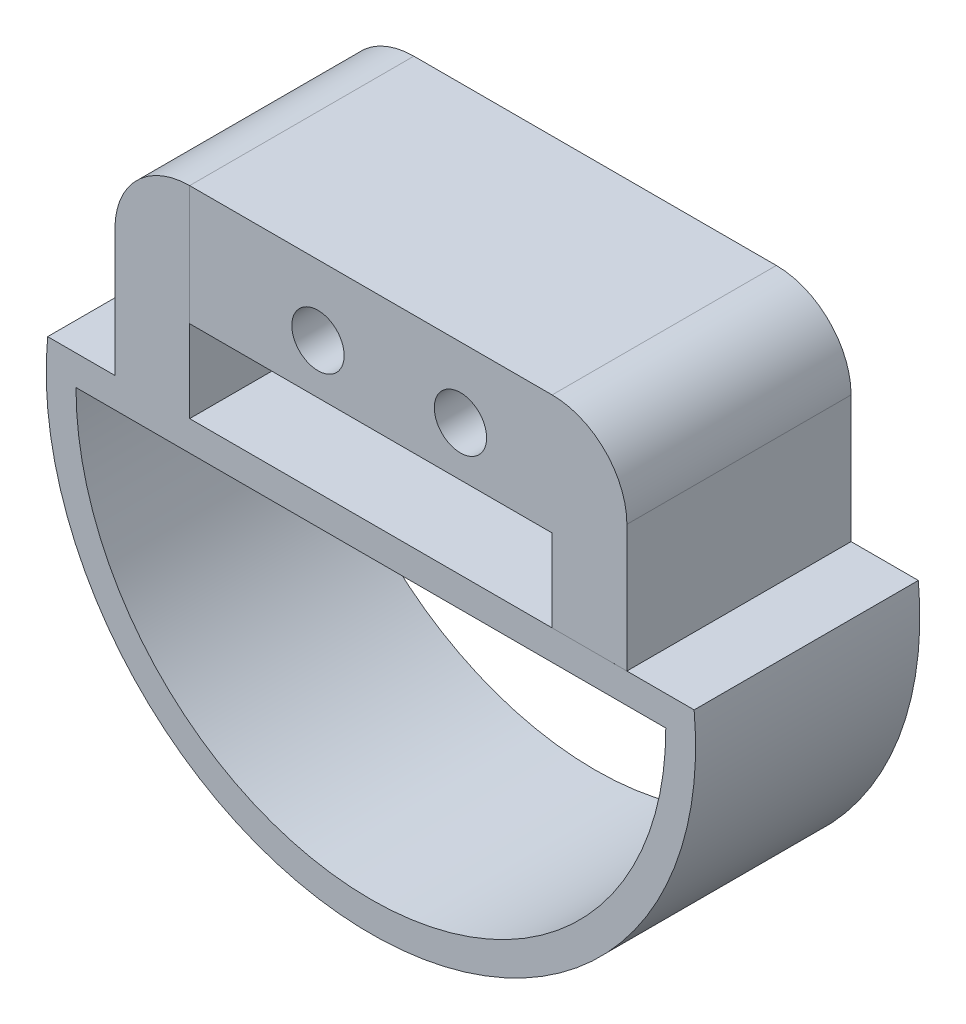
ISO-10303-21;
HEADER;
FILE_DESCRIPTION(('STEP AP214'),'2;1');
FILE_NAME('part.step','',(''),(''),'','','');
FILE_SCHEMA(('AUTOMOTIVE_DESIGN { 1 0 10303 214 1 1 1 1 }'));
ENDSEC;
DATA;
#1=APPLICATION_CONTEXT('core data for automotive mechanical design processes');
#2=APPLICATION_PROTOCOL_DEFINITION('international standard','automotive_design',2000,#1);
#3=PRODUCT_CONTEXT('',#1,'mechanical');
#4=PRODUCT('Part','Part','',(#3));
#5=PRODUCT_RELATED_PRODUCT_CATEGORY('part','',(#4));
#6=PRODUCT_DEFINITION_FORMATION('','',#4);
#7=PRODUCT_DEFINITION_CONTEXT('part definition',#1,'design');
#8=PRODUCT_DEFINITION('design','',#6,#7);
#9=PRODUCT_DEFINITION_SHAPE('','',#8);
#10=(LENGTH_UNIT() NAMED_UNIT(*) SI_UNIT(.MILLI.,.METRE.));
#11=(NAMED_UNIT(*) PLANE_ANGLE_UNIT() SI_UNIT($,.RADIAN.));
#12=(NAMED_UNIT(*) SI_UNIT($,.STERADIAN.) SOLID_ANGLE_UNIT());
#13=UNCERTAINTY_MEASURE_WITH_UNIT(LENGTH_MEASURE(1.E-05),#10,'distance_accuracy_value','');
#14=(GEOMETRIC_REPRESENTATION_CONTEXT(3) GLOBAL_UNCERTAINTY_ASSIGNED_CONTEXT((#13)) GLOBAL_UNIT_ASSIGNED_CONTEXT((#10,
#11,#12)) REPRESENTATION_CONTEXT('',''));
#15=CARTESIAN_POINT('',(0.,0.,0.));
#16=DIRECTION('',(0.,0.,1.));
#17=DIRECTION('',(1.,0.,0.));
#18=AXIS2_PLACEMENT_3D('',#15,#16,#17);
#19=CARTESIAN_POINT('',(12.1263897601692,15.5675809394675,14.9999));
#20=DIRECTION('',(1.,0.,0.));
#21=DIRECTION('',(0.,0.,-1.));
#22=AXIS2_PLACEMENT_3D('',#19,#20,#21);
#23=PLANE('',#22);
#24=DIRECTION('',(0.,0.,1.));
#25=VECTOR('',#24,1.);
#26=CARTESIAN_POINT('',(12.1263897601692,7.56758093946746,-9.9999999998408E-05));
#27=LINE('',#26,#25);
#28=CARTESIAN_POINT('',(12.1263897601692,7.56758093946746,-9.9999999998408E-05));
#29=VERTEX_POINT('',#28);
#30=CARTESIAN_POINT('',(12.1263897601692,7.56758093946746,14.9999));
#31=VERTEX_POINT('',#30);
#32=EDGE_CURVE('E161',#29,#31,#27,.T.);
#33=ORIENTED_EDGE('',*,*,#32,.F.);
#34=DIRECTION('',(0.,-1.,0.));
#35=VECTOR('',#34,1.);
#36=CARTESIAN_POINT('',(12.1263897601692,15.5675809394675,-9.99999999993877E-05));
#37=LINE('',#36,#35);
#38=CARTESIAN_POINT('',(12.1263897601692,2.06758093946746,-9.99999999993877E-05));
#39=VERTEX_POINT('',#38);
#40=EDGE_CURVE('E194',#29,#39,#37,.T.);
#41=ORIENTED_EDGE('',*,*,#40,.T.);
#42=DIRECTION('',(0.,0.,1.));
#43=VECTOR('',#42,1.);
#44=CARTESIAN_POINT('',(12.1263897601692,2.06758093946746,14.9999));
#45=LINE('',#44,#43);
#46=CARTESIAN_POINT('',(12.1263897601692,2.06758093946746,14.9999));
#47=VERTEX_POINT('',#46);
#48=EDGE_CURVE('E188',#39,#47,#45,.T.);
#49=ORIENTED_EDGE('',*,*,#48,.T.);
#50=DIRECTION('',(0.,-1.,0.));
#51=VECTOR('',#50,1.);
#52=CARTESIAN_POINT('',(12.1263897601692,15.5675809394675,14.9999));
#53=LINE('',#52,#51);
#54=EDGE_CURVE('E207',#31,#47,#53,.T.);
#55=ORIENTED_EDGE('',*,*,#54,.F.);
#56=EDGE_LOOP('',(#33,#41,#49,#55));
#57=FACE_BOUND('',#56,.T.);
#58=ADVANCED_FACE('F41',(#57),#23,.F.);
#59=CARTESIAN_POINT('',(-12.1263897601692,15.5675809394675,15.));
#60=DIRECTION('',(-1.,0.,0.));
#61=DIRECTION('',(0.,0.,1.));
#62=AXIS2_PLACEMENT_3D('',#59,#60,#61);
#63=PLANE('',#62);
#64=DIRECTION('',(0.,0.,1.));
#65=VECTOR('',#64,1.);
#66=CARTESIAN_POINT('',(-12.1263897601692,7.56758093946746,-9.99999999944929E-05));
#67=LINE('',#66,#65);
#68=CARTESIAN_POINT('',(-12.1263897601692,7.56758093946746,-9.99999999956032E-05));
#69=VERTEX_POINT('',#68);
#70=CARTESIAN_POINT('',(-12.1263897601692,7.56758093946746,14.9999));
#71=VERTEX_POINT('',#70);
#72=EDGE_CURVE('E155',#69,#71,#67,.T.);
#73=ORIENTED_EDGE('',*,*,#72,.T.);
#74=DIRECTION('',(0.,1.,0.));
#75=VECTOR('',#74,1.);
#76=CARTESIAN_POINT('',(-12.1263897601692,15.5675809394675,14.9999));
#77=LINE('',#76,#75);
#78=CARTESIAN_POINT('',(-12.1263897601692,15.5675809394675,14.9999));
#79=VERTEX_POINT('',#78);
#80=EDGE_CURVE('E143',#71,#79,#77,.T.);
#81=ORIENTED_EDGE('',*,*,#80,.T.);
#82=DIRECTION('',(0.,0.,-1.));
#83=VECTOR('',#82,1.);
#84=CARTESIAN_POINT('',(-12.1263897601692,15.5675809394675,15.));
#85=LINE('',#84,#83);
#86=CARTESIAN_POINT('',(-12.1263897601692,15.5675809394675,15.));
#87=VERTEX_POINT('',#86);
#88=EDGE_CURVE('E174',#87,#79,#85,.T.);
#89=ORIENTED_EDGE('',*,*,#88,.F.);
#90=DIRECTION('',(0.,-1.,0.));
#91=VECTOR('',#90,1.);
#92=CARTESIAN_POINT('',(-12.1263897601692,15.5675809394675,15.));
#93=LINE('',#92,#91);
#94=CARTESIAN_POINT('',(-12.1263897601692,2.06758093946746,15.));
#95=VERTEX_POINT('',#94);
#96=EDGE_CURVE('E184',#87,#95,#93,.T.);
#97=ORIENTED_EDGE('',*,*,#96,.T.);
#98=DIRECTION('',(0.,0.,-1.));
#99=VECTOR('',#98,1.);
#100=CARTESIAN_POINT('',(-12.1263897601692,2.06758093946746,15.));
#101=LINE('',#100,#99);
#102=CARTESIAN_POINT('',(-12.1263897601692,2.06758093946746,-0.0001));
#103=VERTEX_POINT('',#102);
#104=EDGE_CURVE('E177',#95,#103,#101,.T.);
#105=ORIENTED_EDGE('',*,*,#104,.T.);
#106=DIRECTION('',(0.,-1.,0.));
#107=VECTOR('',#106,1.);
#108=CARTESIAN_POINT('',(-12.1263897601692,15.5675809394675,-0.0001));
#109=LINE('',#108,#107);
#110=EDGE_CURVE('E167',#69,#103,#109,.T.);
#111=ORIENTED_EDGE('',*,*,#110,.F.);
#112=EDGE_LOOP('',(#73,#81,#89,#97,#105,#111));
#113=FACE_BOUND('',#112,.T.);
#114=ADVANCED_FACE('F165',(#113),#63,.F.);
#115=CARTESIAN_POINT('',(-21.6263897601692,2.06758093946746,-0.0001));
#116=DIRECTION('',(0.,1.,0.));
#117=DIRECTION('',(0.,0.,1.));
#118=AXIS2_PLACEMENT_3D('',#115,#116,#117);
#119=PLANE('',#118);
#120=DIRECTION('',(-1.,0.,0.));
#121=VECTOR('',#120,1.);
#122=CARTESIAN_POINT('',(-21.6263897601692,2.06758093946746,15.));
#123=LINE('',#122,#121);
#124=CARTESIAN_POINT('',(-17.1263897601692,2.06758093946746,15.));
#125=VERTEX_POINT('',#124);
#126=CARTESIAN_POINT('',(-21.6263897601692,2.06758093946746,15.));
#127=VERTEX_POINT('',#126);
#128=EDGE_CURVE('E228',#125,#127,#123,.T.);
#129=ORIENTED_EDGE('',*,*,#128,.F.);
#130=DIRECTION('',(0.,0.,1.));
#131=VECTOR('',#130,1.);
#132=CARTESIAN_POINT('',(-17.1263897601692,2.06758093946746,15.));
#133=LINE('',#132,#131);
#134=CARTESIAN_POINT('',(-17.1263897601692,2.06758093946746,-0.0001));
#135=VERTEX_POINT('',#134);
#136=EDGE_CURVE('E178',#135,#125,#133,.T.);
#137=ORIENTED_EDGE('',*,*,#136,.F.);
#138=DIRECTION('',(-1.,0.,0.));
#139=VECTOR('',#138,1.);
#140=CARTESIAN_POINT('',(-21.6263897601692,2.06758093946746,-0.0001));
#141=LINE('',#140,#139);
#142=CARTESIAN_POINT('',(-21.6263897601692,2.06758093946746,-0.0001));
#143=VERTEX_POINT('',#142);
#144=EDGE_CURVE('E235',#135,#143,#141,.T.);
#145=ORIENTED_EDGE('',*,*,#144,.T.);
#146=DIRECTION('',(0.,0.,1.));
#147=VECTOR('',#146,1.);
#148=CARTESIAN_POINT('',(-21.6263897601692,2.06758093946746,-0.0001));
#149=LINE('',#148,#147);
#150=EDGE_CURVE('E241',#143,#127,#149,.T.);
#151=ORIENTED_EDGE('',*,*,#150,.T.);
#152=EDGE_LOOP('',(#129,#137,#145,#151));
#153=FACE_BOUND('',#152,.T.);
#154=ADVANCED_FACE('F294',(#153),#119,.T.);
#155=EDGE_CURVE('E240',#39,#103,#141,.T.);
#156=ORIENTED_EDGE('',*,*,#155,.T.);
#157=ORIENTED_EDGE('',*,*,#104,.F.);
#158=CARTESIAN_POINT('',(21.6263897601692,2.06758093946746,15.));
#159=VERTEX_POINT('',#158);
#160=EDGE_CURVE('E229',#159,#95,#123,.T.);
#161=ORIENTED_EDGE('',*,*,#160,.F.);
#162=DIRECTION('',(0.,0.,1.));
#163=VECTOR('',#162,1.);
#164=CARTESIAN_POINT('',(21.6263897601692,2.06758093946746,-0.0001));
#165=LINE('',#164,#163);
#166=CARTESIAN_POINT('',(21.6263897601692,2.06758093946746,-0.0001));
#167=VERTEX_POINT('',#166);
#168=EDGE_CURVE('E239',#167,#159,#165,.T.);
#169=ORIENTED_EDGE('',*,*,#168,.F.);
#170=CARTESIAN_POINT('',(17.1263897601692,2.06758093946746,-0.0001));
#171=VERTEX_POINT('',#170);
#172=EDGE_CURVE('E236',#167,#171,#141,.T.);
#173=ORIENTED_EDGE('',*,*,#172,.T.);
#174=DIRECTION('',(0.,0.,-1.));
#175=VECTOR('',#174,1.);
#176=CARTESIAN_POINT('',(17.1263897601692,2.06758093946746,14.9999));
#177=LINE('',#176,#175);
#178=CARTESIAN_POINT('',(17.1263897601692,2.06758093946746,14.9999));
#179=VERTEX_POINT('',#178);
#180=EDGE_CURVE('E191',#179,#171,#177,.T.);
#181=ORIENTED_EDGE('',*,*,#180,.F.);
#182=DIRECTION('',(1.,0.,0.));
#183=VECTOR('',#182,1.);
#184=CARTESIAN_POINT('',(17.1263897601692,2.06758093946746,14.9999));
#185=LINE('',#184,#183);
#186=EDGE_CURVE('E197',#47,#179,#185,.T.);
#187=ORIENTED_EDGE('',*,*,#186,.F.);
#188=ORIENTED_EDGE('',*,*,#48,.F.);
#189=EDGE_LOOP('',(#156,#157,#161,#169,#173,#181,#187,#188));
#190=FACE_BOUND('',#189,.T.);
#191=ADVANCED_FACE('F268',(#190),#119,.T.);
#192=CARTESIAN_POINT('',(0.,0.,-0.0001));
#193=DIRECTION('',(0.,0.,1.));
#194=DIRECTION('',(1.,0.,0.));
#195=AXIS2_PLACEMENT_3D('',#192,#193,#194);
#196=CYLINDRICAL_SURFACE('',#195,21.725);
#197=ORIENTED_EDGE('',*,*,#168,.T.);
#198=CARTESIAN_POINT('',(0.,0.,15.));
#199=DIRECTION('',(0.,0.,1.));
#200=DIRECTION('',(-1.,0.,0.));
#201=AXIS2_PLACEMENT_3D('',#198,#199,#200);
#202=CIRCLE('',#201,21.725);
#203=EDGE_CURVE('E223',#127,#159,#202,.T.);
#204=ORIENTED_EDGE('',*,*,#203,.F.);
#205=ORIENTED_EDGE('',*,*,#150,.F.);
#206=CARTESIAN_POINT('',(0.,0.,-0.0001));
#207=DIRECTION('',(0.,0.,1.));
#208=DIRECTION('',(-1.,0.,0.));
#209=AXIS2_PLACEMENT_3D('',#206,#207,#208);
#210=CIRCLE('',#209,21.725);
#211=EDGE_CURVE('E232',#143,#167,#210,.T.);
#212=ORIENTED_EDGE('',*,*,#211,.T.);
#213=EDGE_LOOP('',(#197,#204,#205,#212));
#214=FACE_BOUND('',#213,.T.);
#215=ADVANCED_FACE('F276',(#214),#196,.T.);
#216=CARTESIAN_POINT('',(0.,0.,-0.0001));
#217=DIRECTION('',(0.,0.,-1.));
#218=DIRECTION('',(-1.,0.,0.));
#219=AXIS2_PLACEMENT_3D('',#216,#217,#218);
#220=PLANE('',#219);
#221=CARTESIAN_POINT('',(5.99165661456528,10.8856804255023,-0.0001));
#222=DIRECTION('',(0.,0.,-1.));
#223=DIRECTION('',(-1.,0.,0.));
#224=AXIS2_PLACEMENT_3D('',#221,#222,#223);
#225=CIRCLE('',#224,1.75);
#226=CARTESIAN_POINT('',(4.24165661456528,10.8856804255023,-0.0001));
#227=VERTEX_POINT('',#226);
#228=EDGE_CURVE('E332',#227,#227,#225,.T.);
#229=ORIENTED_EDGE('',*,*,#228,.F.);
#230=EDGE_LOOP('',(#229));
#231=FACE_BOUND('',#230,.T.);
#232=CARTESIAN_POINT('',(-3.54050759685393,10.8856804255023,-0.0001));
#233=DIRECTION('',(0.,0.,-1.));
#234=DIRECTION('',(-1.,0.,0.));
#235=AXIS2_PLACEMENT_3D('',#232,#233,#234);
#236=CIRCLE('',#235,1.75);
#237=CARTESIAN_POINT('',(-5.29050759685393,10.8856804255023,-0.0001));
#238=VERTEX_POINT('',#237);
#239=EDGE_CURVE('E171',#238,#238,#236,.T.);
#240=ORIENTED_EDGE('',*,*,#239,.F.);
#241=EDGE_LOOP('',(#240));
#242=FACE_BOUND('',#241,.T.);
#243=ORIENTED_EDGE('',*,*,#40,.F.);
#244=DIRECTION('',(1.,0.,0.));
#245=VECTOR('',#244,1.);
#246=CARTESIAN_POINT('',(-21.727,7.56758093946746,-9.99999999944929E-05));
#247=LINE('',#246,#245);
#248=EDGE_CURVE('E154',#69,#29,#247,.T.);
#249=ORIENTED_EDGE('',*,*,#248,.F.);
#250=ORIENTED_EDGE('',*,*,#110,.T.);
#251=ORIENTED_EDGE('',*,*,#155,.F.);
#252=EDGE_LOOP('',(#243,#249,#250,#251));
#253=FACE_BOUND('',#252,.T.);
#254=CARTESIAN_POINT('',(0.,0.,-9.99999999994061E-05));
#255=DIRECTION('',(0.,0.,1.));
#256=DIRECTION('',(-1.,0.,0.));
#257=AXIS2_PLACEMENT_3D('',#254,#255,#256);
#258=CIRCLE('',#257,19.73);
#259=CARTESIAN_POINT('',(-19.7298842575576,0.0675809394674615,-0.0001));
#260=VERTEX_POINT('',#259);
#261=CARTESIAN_POINT('',(19.7298842575576,0.0675809394674615,-9.99999999994061E-05));
#262=VERTEX_POINT('',#261);
#263=EDGE_CURVE('E210',#260,#262,#258,.T.);
#264=ORIENTED_EDGE('',*,*,#263,.T.);
#265=DIRECTION('',(-1.,0.,0.));
#266=VECTOR('',#265,1.);
#267=CARTESIAN_POINT('',(-19.7298842575576,0.0675809394674615,-9.99999999994061E-05));
#268=LINE('',#267,#266);
#269=EDGE_CURVE('E213',#262,#260,#268,.T.);
#270=ORIENTED_EDGE('',*,*,#269,.T.);
#271=EDGE_LOOP('',(#264,#270));
#272=FACE_BOUND('',#271,.T.);
#273=DIRECTION('',(0.,-1.,0.));
#274=VECTOR('',#273,1.);
#275=CARTESIAN_POINT('',(-17.1263897601692,15.5675809394675,-0.0001));
#276=LINE('',#275,#274);
#277=CARTESIAN_POINT('',(-17.1263897601692,10.5675809394675,-0.0001));
#278=VERTEX_POINT('',#277);
#279=EDGE_CURVE('E176',#278,#135,#276,.T.);
#280=ORIENTED_EDGE('',*,*,#279,.F.);
#281=CARTESIAN_POINT('',(-12.1263897601692,10.5675809394675,-0.0001));
#282=DIRECTION('',(0.,0.,-1.));
#283=DIRECTION('',(-1.,0.,0.));
#284=AXIS2_PLACEMENT_3D('',#281,#282,#283);
#285=CIRCLE('',#284,5.);
#286=CARTESIAN_POINT('',(-12.1263897601692,15.5675809394675,-9.99999999964176E-05));
#287=VERTEX_POINT('',#286);
#288=EDGE_CURVE('E11',#278,#287,#285,.T.);
#289=ORIENTED_EDGE('',*,*,#288,.T.);
#290=DIRECTION('',(-1.,0.,0.));
#291=VECTOR('',#290,1.);
#292=CARTESIAN_POINT('',(17.1263897601692,15.5675809394675,-0.0001));
#293=LINE('',#292,#291);
#294=CARTESIAN_POINT('',(12.1263897601692,15.5675809394675,-9.99999999993877E-05));
#295=VERTEX_POINT('',#294);
#296=EDGE_CURVE('E190',#295,#287,#293,.T.);
#297=ORIENTED_EDGE('',*,*,#296,.F.);
#298=CARTESIAN_POINT('',(12.1263897601692,10.5675809394675,-0.0001));
#299=DIRECTION('',(0.,0.,-1.));
#300=DIRECTION('',(-1.,0.,0.));
#301=AXIS2_PLACEMENT_3D('',#298,#299,#300);
#302=CIRCLE('',#301,5.);
#303=CARTESIAN_POINT('',(17.1263897601692,10.5675809394675,-0.0001));
#304=VERTEX_POINT('',#303);
#305=EDGE_CURVE('E248',#295,#304,#302,.T.);
#306=ORIENTED_EDGE('',*,*,#305,.T.);
#307=DIRECTION('',(0.,-1.,0.));
#308=VECTOR('',#307,1.);
#309=CARTESIAN_POINT('',(17.1263897601692,15.5675809394675,-0.0001));
#310=LINE('',#309,#308);
#311=EDGE_CURVE('E203',#304,#171,#310,.T.);
#312=ORIENTED_EDGE('',*,*,#311,.T.);
#313=ORIENTED_EDGE('',*,*,#172,.F.);
#314=ORIENTED_EDGE('',*,*,#211,.F.);
#315=ORIENTED_EDGE('',*,*,#144,.F.);
#316=EDGE_LOOP('',(#280,#289,#297,#306,#312,#313,#314,#315));
#317=FACE_BOUND('',#316,.T.);
#318=ADVANCED_FACE('F289',(#231,#242,#253,#272,#317),#220,.T.);
#319=CARTESIAN_POINT('',(0.,0.,15.));
#320=DIRECTION('',(0.,0.,-1.));
#321=DIRECTION('',(-1.,0.,0.));
#322=AXIS2_PLACEMENT_3D('',#319,#320,#321);
#323=PLANE('',#322);
#324=DIRECTION('',(-1.,0.,0.));
#325=VECTOR('',#324,1.);
#326=CARTESIAN_POINT('',(-19.7298842575576,0.0675809394674615,15.));
#327=LINE('',#326,#325);
#328=CARTESIAN_POINT('',(19.7298842575576,0.0675809394674615,15.));
#329=VERTEX_POINT('',#328);
#330=CARTESIAN_POINT('',(-19.7298842575576,0.0675809394674615,15.));
#331=VERTEX_POINT('',#330);
#332=EDGE_CURVE('E214',#329,#331,#327,.T.);
#333=ORIENTED_EDGE('',*,*,#332,.F.);
#334=CARTESIAN_POINT('',(0.,0.,15.));
#335=DIRECTION('',(0.,0.,1.));
#336=DIRECTION('',(-1.,0.,0.));
#337=AXIS2_PLACEMENT_3D('',#334,#335,#336);
#338=CIRCLE('',#337,19.73);
#339=EDGE_CURVE('E209',#331,#329,#338,.T.);
#340=ORIENTED_EDGE('',*,*,#339,.F.);
#341=EDGE_LOOP('',(#333,#340));
#342=FACE_BOUND('',#341,.T.);
#343=ORIENTED_EDGE('',*,*,#96,.F.);
#344=CARTESIAN_POINT('',(-12.1263897601692,10.5675809394675,15.));
#345=DIRECTION('',(0.,0.,-1.));
#346=DIRECTION('',(-1.,0.,0.));
#347=AXIS2_PLACEMENT_3D('',#344,#345,#346);
#348=CIRCLE('',#347,5.);
#349=CARTESIAN_POINT('',(-17.1263897601692,10.5675809394675,15.));
#350=VERTEX_POINT('',#349);
#351=EDGE_CURVE('E63',#87,#350,#348,.F.);
#352=ORIENTED_EDGE('',*,*,#351,.T.);
#353=DIRECTION('',(0.,-1.,0.));
#354=VECTOR('',#353,1.);
#355=CARTESIAN_POINT('',(-17.1263897601692,15.5675809394675,15.));
#356=LINE('',#355,#354);
#357=EDGE_CURVE('E186',#350,#125,#356,.T.);
#358=ORIENTED_EDGE('',*,*,#357,.T.);
#359=ORIENTED_EDGE('',*,*,#128,.T.);
#360=ORIENTED_EDGE('',*,*,#203,.T.);
#361=ORIENTED_EDGE('',*,*,#160,.T.);
#362=EDGE_LOOP('',(#343,#352,#358,#359,#360,#361));
#363=FACE_BOUND('',#362,.T.);
#364=ADVANCED_FACE('F271',(#342,#363),#323,.F.);
#365=CARTESIAN_POINT('',(0.,0.,-9.99999999994061E-05));
#366=DIRECTION('',(0.,0.,1.));
#367=DIRECTION('',(1.,0.,0.));
#368=AXIS2_PLACEMENT_3D('',#365,#366,#367);
#369=CYLINDRICAL_SURFACE('',#368,19.73);
#370=ORIENTED_EDGE('',*,*,#339,.T.);
#371=DIRECTION('',(0.,0.,1.));
#372=VECTOR('',#371,1.);
#373=CARTESIAN_POINT('',(19.7298842575576,0.0675809394674615,-9.99999999994061E-05));
#374=LINE('',#373,#372);
#375=EDGE_CURVE('E217',#262,#329,#374,.T.);
#376=ORIENTED_EDGE('',*,*,#375,.F.);
#377=ORIENTED_EDGE('',*,*,#263,.F.);
#378=DIRECTION('',(0.,0.,1.));
#379=VECTOR('',#378,1.);
#380=CARTESIAN_POINT('',(-19.7298842575576,0.0675809394674615,-9.99999999994061E-05));
#381=LINE('',#380,#379);
#382=EDGE_CURVE('E221',#260,#331,#381,.T.);
#383=ORIENTED_EDGE('',*,*,#382,.T.);
#384=EDGE_LOOP('',(#370,#376,#377,#383));
#385=FACE_BOUND('',#384,.T.);
#386=ADVANCED_FACE('F317',(#385),#369,.F.);
#387=CARTESIAN_POINT('',(-19.7298842575576,0.0675809394674615,-9.99999999994061E-05));
#388=DIRECTION('',(0.,1.,0.));
#389=DIRECTION('',(0.,0.,1.));
#390=AXIS2_PLACEMENT_3D('',#387,#388,#389);
#391=PLANE('',#390);
#392=ORIENTED_EDGE('',*,*,#332,.T.);
#393=ORIENTED_EDGE('',*,*,#382,.F.);
#394=ORIENTED_EDGE('',*,*,#269,.F.);
#395=ORIENTED_EDGE('',*,*,#375,.T.);
#396=EDGE_LOOP('',(#392,#393,#394,#395));
#397=FACE_BOUND('',#396,.T.);
#398=ADVANCED_FACE('F314',(#397),#391,.F.);
#399=CARTESIAN_POINT('',(17.1263897601692,15.5675809394675,14.9999));
#400=DIRECTION('',(0.,0.,-1.));
#401=DIRECTION('',(-1.,0.,0.));
#402=AXIS2_PLACEMENT_3D('',#399,#400,#401);
#403=PLANE('',#402);
#404=CARTESIAN_POINT('',(5.99165661456528,10.8856804255023,14.9999));
#405=DIRECTION('',(0.,0.,-1.));
#406=DIRECTION('',(-1.,0.,0.));
#407=AXIS2_PLACEMENT_3D('',#404,#405,#406);
#408=CIRCLE('',#407,1.75);
#409=CARTESIAN_POINT('',(4.24165661456528,10.8856804255023,14.9999));
#410=VERTEX_POINT('',#409);
#411=EDGE_CURVE('E346',#410,#410,#408,.F.);
#412=ORIENTED_EDGE('',*,*,#411,.F.);
#413=EDGE_LOOP('',(#412));
#414=FACE_BOUND('',#413,.T.);
#415=CARTESIAN_POINT('',(-3.54050759685393,10.8856804255023,14.9999));
#416=DIRECTION('',(0.,0.,-1.));
#417=DIRECTION('',(-1.,0.,0.));
#418=AXIS2_PLACEMENT_3D('',#415,#416,#417);
#419=CIRCLE('',#418,1.75);
#420=CARTESIAN_POINT('',(-5.29050759685393,10.8856804255023,14.9999));
#421=VERTEX_POINT('',#420);
#422=EDGE_CURVE('E168',#421,#421,#419,.F.);
#423=ORIENTED_EDGE('',*,*,#422,.F.);
#424=EDGE_LOOP('',(#423));
#425=FACE_BOUND('',#424,.T.);
#426=DIRECTION('',(0.,-1.,0.));
#427=VECTOR('',#426,1.);
#428=CARTESIAN_POINT('',(17.1263897601692,15.5675809394675,14.9999));
#429=LINE('',#428,#427);
#430=CARTESIAN_POINT('',(17.1263897601692,10.5675809394675,14.9999));
#431=VERTEX_POINT('',#430);
#432=EDGE_CURVE('E205',#431,#179,#429,.T.);
#433=ORIENTED_EDGE('',*,*,#432,.F.);
#434=CARTESIAN_POINT('',(12.1263897601692,10.5675809394675,14.9999));
#435=DIRECTION('',(0.,0.,-1.));
#436=DIRECTION('',(-1.,0.,0.));
#437=AXIS2_PLACEMENT_3D('',#434,#435,#436);
#438=CIRCLE('',#437,5.);
#439=CARTESIAN_POINT('',(12.1263897601692,15.5675809394675,14.9999));
#440=VERTEX_POINT('',#439);
#441=EDGE_CURVE('E252',#431,#440,#438,.F.);
#442=ORIENTED_EDGE('',*,*,#441,.T.);
#443=DIRECTION('',(1.,0.,0.));
#444=VECTOR('',#443,1.);
#445=CARTESIAN_POINT('',(17.1263897601692,15.5675809394675,14.9999));
#446=LINE('',#445,#444);
#447=EDGE_CURVE('E150',#79,#440,#446,.T.);
#448=ORIENTED_EDGE('',*,*,#447,.F.);
#449=ORIENTED_EDGE('',*,*,#80,.F.);
#450=DIRECTION('',(1.,0.,0.));
#451=VECTOR('',#450,1.);
#452=CARTESIAN_POINT('',(-21.727,7.56758093946746,14.9999));
#453=LINE('',#452,#451);
#454=EDGE_CURVE('E147',#71,#31,#453,.T.);
#455=ORIENTED_EDGE('',*,*,#454,.T.);
#456=ORIENTED_EDGE('',*,*,#54,.T.);
#457=ORIENTED_EDGE('',*,*,#186,.T.);
#458=EDGE_LOOP('',(#433,#442,#448,#449,#455,#456,#457));
#459=FACE_BOUND('',#458,.T.);
#460=ADVANCED_FACE('F146',(#414,#425,#459),#403,.F.);
#461=CARTESIAN_POINT('',(17.1263897601692,15.5675809394675,14.9999));
#462=DIRECTION('',(-1.,0.,0.));
#463=DIRECTION('',(0.,0.,1.));
#464=AXIS2_PLACEMENT_3D('',#461,#462,#463);
#465=PLANE('',#464);
#466=ORIENTED_EDGE('',*,*,#311,.F.);
#467=DIRECTION('',(0.,0.,-1.));
#468=VECTOR('',#467,1.);
#469=CARTESIAN_POINT('',(17.1263897601692,10.5675809394675,14.9999));
#470=LINE('',#469,#468);
#471=EDGE_CURVE('E250',#304,#431,#470,.F.);
#472=ORIENTED_EDGE('',*,*,#471,.T.);
#473=ORIENTED_EDGE('',*,*,#432,.T.);
#474=ORIENTED_EDGE('',*,*,#180,.T.);
#475=EDGE_LOOP('',(#466,#472,#473,#474));
#476=FACE_BOUND('',#475,.T.);
#477=ADVANCED_FACE('F284',(#476),#465,.F.);
#478=CARTESIAN_POINT('',(0.,15.5675809394675,0.));
#479=DIRECTION('',(0.,1.,0.));
#480=DIRECTION('',(0.,0.,1.));
#481=AXIS2_PLACEMENT_3D('',#478,#479,#480);
#482=PLANE('',#481);
#483=ORIENTED_EDGE('',*,*,#296,.T.);
#484=DIRECTION('',(0.,0.,1.));
#485=VECTOR('',#484,1.);
#486=CARTESIAN_POINT('',(-12.1263897601692,15.5675809394675,15.));
#487=LINE('',#486,#485);
#488=EDGE_CURVE('E254',#287,#79,#487,.T.);
#489=ORIENTED_EDGE('',*,*,#488,.T.);
#490=ORIENTED_EDGE('',*,*,#447,.T.);
#491=DIRECTION('',(0.,0.,-1.));
#492=VECTOR('',#491,1.);
#493=CARTESIAN_POINT('',(12.1263897601692,15.5675809394675,-9.99999999988435E-05));
#494=LINE('',#493,#492);
#495=EDGE_CURVE('E244',#440,#295,#494,.T.);
#496=ORIENTED_EDGE('',*,*,#495,.T.);
#497=EDGE_LOOP('',(#483,#489,#490,#496));
#498=FACE_BOUND('',#497,.T.);
#499=ADVANCED_FACE('F259',(#498),#482,.T.);
#500=CARTESIAN_POINT('',(-17.1263897601692,15.5675809394675,15.));
#501=DIRECTION('',(1.,0.,0.));
#502=DIRECTION('',(0.,0.,-1.));
#503=AXIS2_PLACEMENT_3D('',#500,#501,#502);
#504=PLANE('',#503);
#505=ORIENTED_EDGE('',*,*,#357,.F.);
#506=DIRECTION('',(0.,0.,1.));
#507=VECTOR('',#506,1.);
#508=CARTESIAN_POINT('',(-17.1263897601692,10.5675809394675,-0.0001));
#509=LINE('',#508,#507);
#510=EDGE_CURVE('E49',#350,#278,#509,.F.);
#511=ORIENTED_EDGE('',*,*,#510,.T.);
#512=ORIENTED_EDGE('',*,*,#279,.T.);
#513=ORIENTED_EDGE('',*,*,#136,.T.);
#514=EDGE_LOOP('',(#505,#511,#512,#513));
#515=FACE_BOUND('',#514,.T.);
#516=ADVANCED_FACE('F292',(#515),#504,.F.);
#517=CARTESIAN_POINT('',(-21.727,7.56758093946746,-9.99999999944929E-05));
#518=DIRECTION('',(0.,1.,0.));
#519=DIRECTION('',(0.,0.,1.));
#520=AXIS2_PLACEMENT_3D('',#517,#518,#519);
#521=PLANE('',#520);
#522=ORIENTED_EDGE('',*,*,#72,.F.);
#523=ORIENTED_EDGE('',*,*,#248,.T.);
#524=ORIENTED_EDGE('',*,*,#32,.T.);
#525=ORIENTED_EDGE('',*,*,#454,.F.);
#526=EDGE_LOOP('',(#522,#523,#524,#525));
#527=FACE_BOUND('',#526,.T.);
#528=ADVANCED_FACE('F158',(#527),#521,.F.);
#529=CARTESIAN_POINT('',(-3.54050759685393,10.8856804255023,15.001));
#530=DIRECTION('',(0.,0.,-1.));
#531=DIRECTION('',(-1.,0.,0.));
#532=AXIS2_PLACEMENT_3D('',#529,#530,#531);
#533=CYLINDRICAL_SURFACE('',#532,1.75);
#534=ORIENTED_EDGE('',*,*,#239,.T.);
#535=EDGE_LOOP('',(#534));
#536=FACE_BOUND('',#535,.T.);
#537=ORIENTED_EDGE('',*,*,#422,.T.);
#538=EDGE_LOOP('',(#537));
#539=FACE_BOUND('',#538,.T.);
#540=ADVANCED_FACE('F353',(#536,#539),#533,.F.);
#541=CARTESIAN_POINT('',(5.99165661456528,10.8856804255023,15.001));
#542=DIRECTION('',(0.,0.,-1.));
#543=DIRECTION('',(-1.,0.,0.));
#544=AXIS2_PLACEMENT_3D('',#541,#542,#543);
#545=CYLINDRICAL_SURFACE('',#544,1.75);
#546=ORIENTED_EDGE('',*,*,#228,.T.);
#547=EDGE_LOOP('',(#546));
#548=FACE_BOUND('',#547,.T.);
#549=ORIENTED_EDGE('',*,*,#411,.T.);
#550=EDGE_LOOP('',(#549));
#551=FACE_BOUND('',#550,.T.);
#552=ADVANCED_FACE('F350',(#548,#551),#545,.F.);
#553=CARTESIAN_POINT('',(12.1263897601692,10.5675809394675,0.));
#554=DIRECTION('',(0.,0.,1.));
#555=DIRECTION('',(1.,0.,0.));
#556=AXIS2_PLACEMENT_3D('',#553,#554,#555);
#557=CYLINDRICAL_SURFACE('',#556,5.);
#558=ORIENTED_EDGE('',*,*,#441,.F.);
#559=ORIENTED_EDGE('',*,*,#471,.F.);
#560=ORIENTED_EDGE('',*,*,#305,.F.);
#561=ORIENTED_EDGE('',*,*,#495,.F.);
#562=EDGE_LOOP('',(#558,#559,#560,#561));
#563=FACE_BOUND('',#562,.T.);
#564=ADVANCED_FACE('F288',(#563),#557,.T.);
#565=CARTESIAN_POINT('',(-12.1263897601692,10.5675809394675,0.));
#566=DIRECTION('',(0.,0.,-1.));
#567=DIRECTION('',(-1.,0.,0.));
#568=AXIS2_PLACEMENT_3D('',#565,#566,#567);
#569=CYLINDRICAL_SURFACE('',#568,5.);
#570=ORIENTED_EDGE('',*,*,#288,.F.);
#571=ORIENTED_EDGE('',*,*,#510,.F.);
#572=ORIENTED_EDGE('',*,*,#351,.F.);
#573=ORIENTED_EDGE('',*,*,#88,.T.);
#574=ORIENTED_EDGE('',*,*,#488,.F.);
#575=EDGE_LOOP('',(#570,#571,#572,#573,#574));
#576=FACE_BOUND('',#575,.T.);
#577=ADVANCED_FACE('F43',(#576),#569,.T.);
#578=CLOSED_SHELL('',(#58,#114,#154,#191,#215,#318,#364,#386,#398,#460,#477,#499,#516,#528,#540,
#552,#564,#577));
#579=MANIFOLD_SOLID_BREP('B2',#578);
#580=ADVANCED_BREP_SHAPE_REPRESENTATION('',(#18,#579),#14);
#581=SHAPE_DEFINITION_REPRESENTATION(#9,#580);
ENDSEC;
END-ISO-10303-21;
